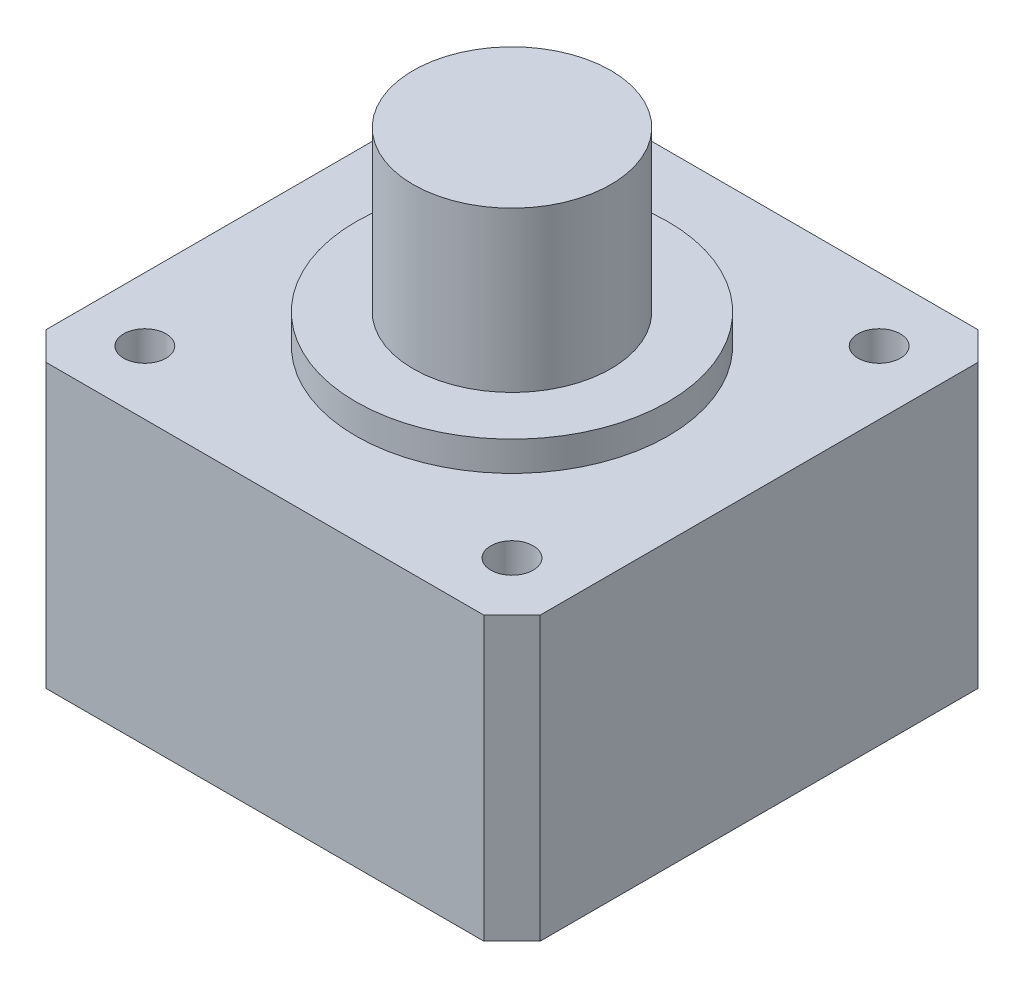
ISO-10303-21;
HEADER;
FILE_DESCRIPTION(('STEP AP214'),'2;1');
FILE_NAME('part.step','',(''),(''),'','','');
FILE_SCHEMA(('AUTOMOTIVE_DESIGN { 1 0 10303 214 1 1 1 1 }'));
ENDSEC;
DATA;
#1=APPLICATION_CONTEXT('core data for automotive mechanical design processes');
#2=APPLICATION_PROTOCOL_DEFINITION('international standard','automotive_design',2000,#1);
#3=PRODUCT_CONTEXT('',#1,'mechanical');
#4=PRODUCT('Part','Part','',(#3));
#5=PRODUCT_RELATED_PRODUCT_CATEGORY('part','',(#4));
#6=PRODUCT_DEFINITION_FORMATION('','',#4);
#7=PRODUCT_DEFINITION_CONTEXT('part definition',#1,'design');
#8=PRODUCT_DEFINITION('design','',#6,#7);
#9=PRODUCT_DEFINITION_SHAPE('','',#8);
#10=(LENGTH_UNIT() NAMED_UNIT(*) SI_UNIT(.MILLI.,.METRE.));
#11=(NAMED_UNIT(*) PLANE_ANGLE_UNIT() SI_UNIT($,.RADIAN.));
#12=(NAMED_UNIT(*) SI_UNIT($,.STERADIAN.) SOLID_ANGLE_UNIT());
#13=UNCERTAINTY_MEASURE_WITH_UNIT(LENGTH_MEASURE(1.E-05),#10,'distance_accuracy_value','');
#14=(GEOMETRIC_REPRESENTATION_CONTEXT(3) GLOBAL_UNCERTAINTY_ASSIGNED_CONTEXT((#13)) GLOBAL_UNIT_ASSIGNED_CONTEXT((#10,
#11,#12)) REPRESENTATION_CONTEXT('',''));
#15=CARTESIAN_POINT('',(0.,0.,0.));
#16=DIRECTION('',(0.,0.,1.));
#17=DIRECTION('',(1.,0.,0.));
#18=AXIS2_PLACEMENT_3D('',#15,#16,#17);
#19=CARTESIAN_POINT('',(0.,22.1,0.));
#20=DIRECTION('',(0.,1.,0.));
#21=DIRECTION('',(0.,0.,1.));
#22=AXIS2_PLACEMENT_3D('',#19,#20,#21);
#23=PLANE('',#22);
#24=CARTESIAN_POINT('',(0.,22.1,0.));
#25=DIRECTION('',(0.,1.,0.));
#26=DIRECTION('',(0.,0.,1.));
#27=AXIS2_PLACEMENT_3D('',#24,#25,#26);
#28=CIRCLE('',#27,11.05);
#29=CARTESIAN_POINT('',(0.,22.1,11.05));
#30=VERTEX_POINT('',#29);
#31=EDGE_CURVE('E192',#30,#30,#28,.T.);
#32=ORIENTED_EDGE('',*,*,#31,.T.);
#33=EDGE_LOOP('',(#32));
#34=FACE_BOUND('',#33,.T.);
#35=CARTESIAN_POINT('',(0.,22.1,0.));
#36=DIRECTION('',(0.,1.,0.));
#37=DIRECTION('',(0.,0.,1.));
#38=AXIS2_PLACEMENT_3D('',#35,#36,#37);
#39=CIRCLE('',#38,7.);
#40=CARTESIAN_POINT('',(0.,22.1,7.));
#41=VERTEX_POINT('',#40);
#42=EDGE_CURVE('E201',#41,#41,#39,.T.);
#43=ORIENTED_EDGE('',*,*,#42,.F.);
#44=EDGE_LOOP('',(#43));
#45=FACE_BOUND('',#44,.T.);
#46=ADVANCED_FACE('F33',(#34,#45),#23,.T.);
#47=CARTESIAN_POINT('',(0.,20.,0.));
#48=DIRECTION('',(0.,1.,0.));
#49=DIRECTION('',(0.,0.,1.));
#50=AXIS2_PLACEMENT_3D('',#47,#48,#49);
#51=PLANE('',#50);
#52=DIRECTION('',(0.,0.,1.));
#53=VECTOR('',#52,1.);
#54=CARTESIAN_POINT('',(-17.5,20.,-17.5));
#55=LINE('',#54,#53);
#56=CARTESIAN_POINT('',(-17.5,20.,-15.5));
#57=VERTEX_POINT('',#56);
#58=CARTESIAN_POINT('',(-17.5,20.,15.5));
#59=VERTEX_POINT('',#58);
#60=EDGE_CURVE('E170',#57,#59,#55,.T.);
#61=ORIENTED_EDGE('',*,*,#60,.T.);
#62=DIRECTION('',(-0.707106781186546,0.,-0.707106781186549));
#63=VECTOR('',#62,1.);
#64=CARTESIAN_POINT('',(-16.5,20.,16.5));
#65=LINE('',#64,#63);
#66=CARTESIAN_POINT('',(-15.5,20.,17.5));
#67=VERTEX_POINT('',#66);
#68=EDGE_CURVE('E147',#59,#67,#65,.F.);
#69=ORIENTED_EDGE('',*,*,#68,.T.);
#70=DIRECTION('',(1.,0.,0.));
#71=VECTOR('',#70,1.);
#72=CARTESIAN_POINT('',(-17.5,20.,17.5));
#73=LINE('',#72,#71);
#74=CARTESIAN_POINT('',(15.5,20.,17.5));
#75=VERTEX_POINT('',#74);
#76=EDGE_CURVE('E119',#67,#75,#73,.T.);
#77=ORIENTED_EDGE('',*,*,#76,.T.);
#78=DIRECTION('',(-0.707106781186551,0.,0.707106781186544));
#79=VECTOR('',#78,1.);
#80=CARTESIAN_POINT('',(16.4999999999999,20.,16.5000000000001));
#81=LINE('',#80,#79);
#82=CARTESIAN_POINT('',(17.5,20.,15.5));
#83=VERTEX_POINT('',#82);
#84=EDGE_CURVE('E142',#75,#83,#81,.F.);
#85=ORIENTED_EDGE('',*,*,#84,.T.);
#86=DIRECTION('',(0.,0.,-1.));
#87=VECTOR('',#86,1.);
#88=CARTESIAN_POINT('',(17.5,20.,-17.5));
#89=LINE('',#88,#87);
#90=CARTESIAN_POINT('',(17.5,20.,-15.5));
#91=VERTEX_POINT('',#90);
#92=EDGE_CURVE('E125',#83,#91,#89,.T.);
#93=ORIENTED_EDGE('',*,*,#92,.T.);
#94=DIRECTION('',(0.707106781186546,0.,0.707106781186549));
#95=VECTOR('',#94,1.);
#96=CARTESIAN_POINT('',(16.5,20.,-16.5));
#97=LINE('',#96,#95);
#98=CARTESIAN_POINT('',(15.5,20.,-17.5));
#99=VERTEX_POINT('',#98);
#100=EDGE_CURVE('E55',#91,#99,#97,.F.);
#101=ORIENTED_EDGE('',*,*,#100,.T.);
#102=DIRECTION('',(-1.,0.,0.));
#103=VECTOR('',#102,1.);
#104=CARTESIAN_POINT('',(-17.5,20.,-17.5));
#105=LINE('',#104,#103);
#106=CARTESIAN_POINT('',(-15.5,20.,-17.5));
#107=VERTEX_POINT('',#106);
#108=EDGE_CURVE('E128',#99,#107,#105,.T.);
#109=ORIENTED_EDGE('',*,*,#108,.T.);
#110=DIRECTION('',(0.70710678118655,0.,-0.707106781186545));
#111=VECTOR('',#110,1.);
#112=CARTESIAN_POINT('',(-16.5,20.,-16.5000000000001));
#113=LINE('',#112,#111);
#114=EDGE_CURVE('E145',#107,#57,#113,.F.);
#115=ORIENTED_EDGE('',*,*,#114,.T.);
#116=EDGE_LOOP('',(#61,#69,#77,#85,#93,#101,#109,#115));
#117=FACE_BOUND('',#116,.T.);
#118=CARTESIAN_POINT('',(-13.,20.,-13.));
#119=DIRECTION('',(0.,1.,0.));
#120=DIRECTION('',(0.,0.,1.));
#121=AXIS2_PLACEMENT_3D('',#118,#119,#120);
#122=CIRCLE('',#121,1.5);
#123=CARTESIAN_POINT('',(-13.,20.,-11.5));
#124=VERTEX_POINT('',#123);
#125=EDGE_CURVE('E166',#124,#124,#122,.T.);
#126=ORIENTED_EDGE('',*,*,#125,.F.);
#127=EDGE_LOOP('',(#126));
#128=FACE_BOUND('',#127,.T.);
#129=CARTESIAN_POINT('',(13.,20.,-13.));
#130=DIRECTION('',(0.,1.,0.));
#131=DIRECTION('',(0.,0.,1.));
#132=AXIS2_PLACEMENT_3D('',#129,#130,#131);
#133=CIRCLE('',#132,1.5);
#134=CARTESIAN_POINT('',(13.,20.,-11.5));
#135=VERTEX_POINT('',#134);
#136=EDGE_CURVE('E175',#135,#135,#133,.T.);
#137=ORIENTED_EDGE('',*,*,#136,.F.);
#138=EDGE_LOOP('',(#137));
#139=FACE_BOUND('',#138,.T.);
#140=CARTESIAN_POINT('',(13.,20.,13.));
#141=DIRECTION('',(0.,1.,0.));
#142=DIRECTION('',(0.,0.,1.));
#143=AXIS2_PLACEMENT_3D('',#140,#141,#142);
#144=CIRCLE('',#143,1.5);
#145=CARTESIAN_POINT('',(13.,20.,14.5));
#146=VERTEX_POINT('',#145);
#147=EDGE_CURVE('E180',#146,#146,#144,.T.);
#148=ORIENTED_EDGE('',*,*,#147,.F.);
#149=EDGE_LOOP('',(#148));
#150=FACE_BOUND('',#149,.T.);
#151=CARTESIAN_POINT('',(-13.,20.,13.));
#152=DIRECTION('',(0.,1.,0.));
#153=DIRECTION('',(0.,0.,1.));
#154=AXIS2_PLACEMENT_3D('',#151,#152,#153);
#155=CIRCLE('',#154,1.5);
#156=CARTESIAN_POINT('',(-13.,20.,14.5));
#157=VERTEX_POINT('',#156);
#158=EDGE_CURVE('E186',#157,#157,#155,.T.);
#159=ORIENTED_EDGE('',*,*,#158,.F.);
#160=EDGE_LOOP('',(#159));
#161=FACE_BOUND('',#160,.T.);
#162=CARTESIAN_POINT('',(0.,20.,0.));
#163=DIRECTION('',(0.,1.,0.));
#164=DIRECTION('',(0.,0.,1.));
#165=AXIS2_PLACEMENT_3D('',#162,#163,#164);
#166=CIRCLE('',#165,11.05);
#167=CARTESIAN_POINT('',(0.,20.,11.05));
#168=VERTEX_POINT('',#167);
#169=EDGE_CURVE('E195',#168,#168,#166,.T.);
#170=ORIENTED_EDGE('',*,*,#169,.F.);
#171=EDGE_LOOP('',(#170));
#172=FACE_BOUND('',#171,.T.);
#173=ADVANCED_FACE('F217',(#117,#128,#139,#150,#161,#172),#51,.T.);
#174=CARTESIAN_POINT('',(17.5,20.,-17.5));
#175=DIRECTION('',(-1.,0.,0.));
#176=DIRECTION('',(0.,0.,1.));
#177=AXIS2_PLACEMENT_3D('',#174,#175,#176);
#178=PLANE('',#177);
#179=DIRECTION('',(0.,0.,-1.));
#180=VECTOR('',#179,1.);
#181=CARTESIAN_POINT('',(17.5,0.,-17.5));
#182=LINE('',#181,#180);
#183=CARTESIAN_POINT('',(17.5,0.,15.5));
#184=VERTEX_POINT('',#183);
#185=CARTESIAN_POINT('',(17.5,0.,-15.5));
#186=VERTEX_POINT('',#185);
#187=EDGE_CURVE('E158',#184,#186,#182,.T.);
#188=ORIENTED_EDGE('',*,*,#187,.T.);
#189=DIRECTION('',(0.,1.,0.));
#190=VECTOR('',#189,1.);
#191=CARTESIAN_POINT('',(17.5,20.,-15.5));
#192=LINE('',#191,#190);
#193=EDGE_CURVE('E11',#186,#91,#192,.T.);
#194=ORIENTED_EDGE('',*,*,#193,.T.);
#195=ORIENTED_EDGE('',*,*,#92,.F.);
#196=DIRECTION('',(0.,-1.,0.));
#197=VECTOR('',#196,1.);
#198=CARTESIAN_POINT('',(17.5,20.,15.5));
#199=LINE('',#198,#197);
#200=EDGE_CURVE('E41',#83,#184,#199,.T.);
#201=ORIENTED_EDGE('',*,*,#200,.T.);
#202=EDGE_LOOP('',(#188,#194,#195,#201));
#203=FACE_BOUND('',#202,.T.);
#204=ADVANCED_FACE('F157',(#203),#178,.F.);
#205=CARTESIAN_POINT('',(-17.5,20.,-17.5));
#206=DIRECTION('',(0.,0.,1.));
#207=DIRECTION('',(1.,0.,0.));
#208=AXIS2_PLACEMENT_3D('',#205,#206,#207);
#209=PLANE('',#208);
#210=DIRECTION('',(-1.,0.,0.));
#211=VECTOR('',#210,1.);
#212=CARTESIAN_POINT('',(-17.5,0.,-17.5));
#213=LINE('',#212,#211);
#214=CARTESIAN_POINT('',(15.5,0.,-17.5));
#215=VERTEX_POINT('',#214);
#216=CARTESIAN_POINT('',(-15.5,0.,-17.5));
#217=VERTEX_POINT('',#216);
#218=EDGE_CURVE('E130',#215,#217,#213,.T.);
#219=ORIENTED_EDGE('',*,*,#218,.T.);
#220=DIRECTION('',(0.,1.,0.));
#221=VECTOR('',#220,1.);
#222=CARTESIAN_POINT('',(-15.5,20.,-17.5));
#223=LINE('',#222,#221);
#224=EDGE_CURVE('E48',#217,#107,#223,.T.);
#225=ORIENTED_EDGE('',*,*,#224,.T.);
#226=ORIENTED_EDGE('',*,*,#108,.F.);
#227=DIRECTION('',(0.,-1.,0.));
#228=VECTOR('',#227,1.);
#229=CARTESIAN_POINT('',(15.5,20.,-17.5));
#230=LINE('',#229,#228);
#231=EDGE_CURVE('E149',#99,#215,#230,.T.);
#232=ORIENTED_EDGE('',*,*,#231,.T.);
#233=EDGE_LOOP('',(#219,#225,#226,#232));
#234=FACE_BOUND('',#233,.T.);
#235=ADVANCED_FACE('F253',(#234),#209,.F.);
#236=CARTESIAN_POINT('',(-17.5,20.,-17.5));
#237=DIRECTION('',(1.,0.,0.));
#238=DIRECTION('',(0.,0.,-1.));
#239=AXIS2_PLACEMENT_3D('',#236,#237,#238);
#240=PLANE('',#239);
#241=DIRECTION('',(0.,0.,1.));
#242=VECTOR('',#241,1.);
#243=CARTESIAN_POINT('',(-17.5,0.,-17.5));
#244=LINE('',#243,#242);
#245=CARTESIAN_POINT('',(-17.5,0.,-15.5));
#246=VERTEX_POINT('',#245);
#247=CARTESIAN_POINT('',(-17.5,0.,15.5));
#248=VERTEX_POINT('',#247);
#249=EDGE_CURVE('E126',#246,#248,#244,.T.);
#250=ORIENTED_EDGE('',*,*,#249,.T.);
#251=DIRECTION('',(0.,1.,0.));
#252=VECTOR('',#251,1.);
#253=CARTESIAN_POINT('',(-17.5,20.,15.5));
#254=LINE('',#253,#252);
#255=EDGE_CURVE('E104',#248,#59,#254,.T.);
#256=ORIENTED_EDGE('',*,*,#255,.T.);
#257=ORIENTED_EDGE('',*,*,#60,.F.);
#258=DIRECTION('',(0.,-1.,0.));
#259=VECTOR('',#258,1.);
#260=CARTESIAN_POINT('',(-17.5,20.,-15.5));
#261=LINE('',#260,#259);
#262=EDGE_CURVE('E109',#57,#246,#261,.T.);
#263=ORIENTED_EDGE('',*,*,#262,.T.);
#264=EDGE_LOOP('',(#250,#256,#257,#263));
#265=FACE_BOUND('',#264,.T.);
#266=ADVANCED_FACE('F250',(#265),#240,.F.);
#267=CARTESIAN_POINT('',(-17.5,20.,17.5));
#268=DIRECTION('',(0.,0.,-1.));
#269=DIRECTION('',(-1.,0.,0.));
#270=AXIS2_PLACEMENT_3D('',#267,#268,#269);
#271=PLANE('',#270);
#272=ORIENTED_EDGE('',*,*,#76,.F.);
#273=DIRECTION('',(0.,-1.,0.));
#274=VECTOR('',#273,1.);
#275=CARTESIAN_POINT('',(-15.5,20.,17.5));
#276=LINE('',#275,#274);
#277=CARTESIAN_POINT('',(-15.5,0.,17.5));
#278=VERTEX_POINT('',#277);
#279=EDGE_CURVE('E103',#67,#278,#276,.T.);
#280=ORIENTED_EDGE('',*,*,#279,.T.);
#281=DIRECTION('',(1.,0.,0.));
#282=VECTOR('',#281,1.);
#283=CARTESIAN_POINT('',(-17.5,0.,17.5));
#284=LINE('',#283,#282);
#285=CARTESIAN_POINT('',(15.5,0.,17.5));
#286=VERTEX_POINT('',#285);
#287=EDGE_CURVE('E116',#278,#286,#284,.T.);
#288=ORIENTED_EDGE('',*,*,#287,.T.);
#289=DIRECTION('',(0.,1.,0.));
#290=VECTOR('',#289,1.);
#291=CARTESIAN_POINT('',(15.5,20.,17.5));
#292=LINE('',#291,#290);
#293=EDGE_CURVE('E121',#286,#75,#292,.T.);
#294=ORIENTED_EDGE('',*,*,#293,.T.);
#295=EDGE_LOOP('',(#272,#280,#288,#294));
#296=FACE_BOUND('',#295,.T.);
#297=ADVANCED_FACE('F115',(#296),#271,.F.);
#298=CARTESIAN_POINT('',(0.,0.,0.));
#299=DIRECTION('',(0.,1.,0.));
#300=DIRECTION('',(0.,0.,1.));
#301=AXIS2_PLACEMENT_3D('',#298,#299,#300);
#302=PLANE('',#301);
#303=CARTESIAN_POINT('',(-13.,0.,13.));
#304=DIRECTION('',(0.,1.,0.));
#305=DIRECTION('',(0.,0.,1.));
#306=AXIS2_PLACEMENT_3D('',#303,#304,#305);
#307=CIRCLE('',#306,1.5);
#308=CARTESIAN_POINT('',(-13.,0.,14.5));
#309=VERTEX_POINT('',#308);
#310=EDGE_CURVE('E189',#309,#309,#307,.T.);
#311=ORIENTED_EDGE('',*,*,#310,.T.);
#312=EDGE_LOOP('',(#311));
#313=FACE_BOUND('',#312,.T.);
#314=CARTESIAN_POINT('',(13.,0.,13.));
#315=DIRECTION('',(0.,1.,0.));
#316=DIRECTION('',(0.,0.,1.));
#317=AXIS2_PLACEMENT_3D('',#314,#315,#316);
#318=CIRCLE('',#317,1.5);
#319=CARTESIAN_POINT('',(13.,0.,14.5));
#320=VERTEX_POINT('',#319);
#321=EDGE_CURVE('E183',#320,#320,#318,.T.);
#322=ORIENTED_EDGE('',*,*,#321,.T.);
#323=EDGE_LOOP('',(#322));
#324=FACE_BOUND('',#323,.T.);
#325=CARTESIAN_POINT('',(13.,0.,-13.));
#326=DIRECTION('',(0.,1.,0.));
#327=DIRECTION('',(0.,0.,1.));
#328=AXIS2_PLACEMENT_3D('',#325,#326,#327);
#329=CIRCLE('',#328,1.5);
#330=CARTESIAN_POINT('',(13.,0.,-11.5));
#331=VERTEX_POINT('',#330);
#332=EDGE_CURVE('E177',#331,#331,#329,.T.);
#333=ORIENTED_EDGE('',*,*,#332,.T.);
#334=EDGE_LOOP('',(#333));
#335=FACE_BOUND('',#334,.T.);
#336=CARTESIAN_POINT('',(-13.,0.,-13.));
#337=DIRECTION('',(0.,1.,0.));
#338=DIRECTION('',(0.,0.,1.));
#339=AXIS2_PLACEMENT_3D('',#336,#337,#338);
#340=CIRCLE('',#339,1.5);
#341=CARTESIAN_POINT('',(-13.,0.,-11.5));
#342=VERTEX_POINT('',#341);
#343=EDGE_CURVE('E163',#342,#342,#340,.T.);
#344=ORIENTED_EDGE('',*,*,#343,.T.);
#345=EDGE_LOOP('',(#344));
#346=FACE_BOUND('',#345,.T.);
#347=ORIENTED_EDGE('',*,*,#287,.F.);
#348=DIRECTION('',(0.707106781186546,0.,0.707106781186549));
#349=VECTOR('',#348,1.);
#350=CARTESIAN_POINT('',(-15.5,0.,17.5));
#351=LINE('',#350,#349);
#352=EDGE_CURVE('E99',#278,#248,#351,.F.);
#353=ORIENTED_EDGE('',*,*,#352,.T.);
#354=ORIENTED_EDGE('',*,*,#249,.F.);
#355=DIRECTION('',(-0.70710678118655,0.,0.707106781186545));
#356=VECTOR('',#355,1.);
#357=CARTESIAN_POINT('',(-17.5,0.,-15.5));
#358=LINE('',#357,#356);
#359=EDGE_CURVE('E110',#246,#217,#358,.F.);
#360=ORIENTED_EDGE('',*,*,#359,.T.);
#361=ORIENTED_EDGE('',*,*,#218,.F.);
#362=DIRECTION('',(-0.707106781186546,0.,-0.707106781186549));
#363=VECTOR('',#362,1.);
#364=CARTESIAN_POINT('',(15.5,0.,-17.5));
#365=LINE('',#364,#363);
#366=EDGE_CURVE('E136',#215,#186,#365,.F.);
#367=ORIENTED_EDGE('',*,*,#366,.T.);
#368=ORIENTED_EDGE('',*,*,#187,.F.);
#369=DIRECTION('',(0.707106781186551,0.,-0.707106781186544));
#370=VECTOR('',#369,1.);
#371=CARTESIAN_POINT('',(17.5,0.,15.5));
#372=LINE('',#371,#370);
#373=EDGE_CURVE('E120',#184,#286,#372,.F.);
#374=ORIENTED_EDGE('',*,*,#373,.T.);
#375=EDGE_LOOP('',(#347,#353,#354,#360,#361,#367,#368,#374));
#376=FACE_BOUND('',#375,.T.);
#377=ADVANCED_FACE('F123',(#313,#324,#335,#346,#376),#302,.F.);
#378=CARTESIAN_POINT('',(-13.,0.,-13.));
#379=DIRECTION('',(0.,1.,0.));
#380=DIRECTION('',(0.,0.,1.));
#381=AXIS2_PLACEMENT_3D('',#378,#379,#380);
#382=CYLINDRICAL_SURFACE('',#381,1.5);
#383=ORIENTED_EDGE('',*,*,#343,.F.);
#384=EDGE_LOOP('',(#383));
#385=FACE_BOUND('',#384,.T.);
#386=ORIENTED_EDGE('',*,*,#125,.T.);
#387=EDGE_LOOP('',(#386));
#388=FACE_BOUND('',#387,.T.);
#389=ADVANCED_FACE('F240',(#385,#388),#382,.F.);
#390=CARTESIAN_POINT('',(13.,0.,-13.));
#391=DIRECTION('',(0.,1.,0.));
#392=DIRECTION('',(0.,0.,1.));
#393=AXIS2_PLACEMENT_3D('',#390,#391,#392);
#394=CYLINDRICAL_SURFACE('',#393,1.5);
#395=ORIENTED_EDGE('',*,*,#332,.F.);
#396=EDGE_LOOP('',(#395));
#397=FACE_BOUND('',#396,.T.);
#398=ORIENTED_EDGE('',*,*,#136,.T.);
#399=EDGE_LOOP('',(#398));
#400=FACE_BOUND('',#399,.T.);
#401=ADVANCED_FACE('F236',(#397,#400),#394,.F.);
#402=CARTESIAN_POINT('',(13.,0.,13.));
#403=DIRECTION('',(0.,1.,0.));
#404=DIRECTION('',(0.,0.,1.));
#405=AXIS2_PLACEMENT_3D('',#402,#403,#404);
#406=CYLINDRICAL_SURFACE('',#405,1.5);
#407=ORIENTED_EDGE('',*,*,#321,.F.);
#408=EDGE_LOOP('',(#407));
#409=FACE_BOUND('',#408,.T.);
#410=ORIENTED_EDGE('',*,*,#147,.T.);
#411=EDGE_LOOP('',(#410));
#412=FACE_BOUND('',#411,.T.);
#413=ADVANCED_FACE('F232',(#409,#412),#406,.F.);
#414=CARTESIAN_POINT('',(-13.,0.,13.));
#415=DIRECTION('',(0.,1.,0.));
#416=DIRECTION('',(0.,0.,1.));
#417=AXIS2_PLACEMENT_3D('',#414,#415,#416);
#418=CYLINDRICAL_SURFACE('',#417,1.5);
#419=ORIENTED_EDGE('',*,*,#310,.F.);
#420=EDGE_LOOP('',(#419));
#421=FACE_BOUND('',#420,.T.);
#422=ORIENTED_EDGE('',*,*,#158,.T.);
#423=EDGE_LOOP('',(#422));
#424=FACE_BOUND('',#423,.T.);
#425=ADVANCED_FACE('F229',(#421,#424),#418,.F.);
#426=CARTESIAN_POINT('',(-15.5,20.,17.5));
#427=DIRECTION('',(0.707106781186549,0.,-0.707106781186546));
#428=DIRECTION('',(0.,-1.,0.));
#429=AXIS2_PLACEMENT_3D('',#426,#427,#428);
#430=PLANE('',#429);
#431=ORIENTED_EDGE('',*,*,#68,.F.);
#432=ORIENTED_EDGE('',*,*,#255,.F.);
#433=ORIENTED_EDGE('',*,*,#352,.F.);
#434=ORIENTED_EDGE('',*,*,#279,.F.);
#435=EDGE_LOOP('',(#431,#432,#433,#434));
#436=FACE_BOUND('',#435,.T.);
#437=ADVANCED_FACE('F102',(#436),#430,.F.);
#438=CARTESIAN_POINT('',(-17.5,20.,-15.5));
#439=DIRECTION('',(0.707106781186545,0.,0.70710678118655));
#440=DIRECTION('',(0.,-1.,0.));
#441=AXIS2_PLACEMENT_3D('',#438,#439,#440);
#442=PLANE('',#441);
#443=ORIENTED_EDGE('',*,*,#114,.F.);
#444=ORIENTED_EDGE('',*,*,#224,.F.);
#445=ORIENTED_EDGE('',*,*,#359,.F.);
#446=ORIENTED_EDGE('',*,*,#262,.F.);
#447=EDGE_LOOP('',(#443,#444,#445,#446));
#448=FACE_BOUND('',#447,.T.);
#449=ADVANCED_FACE('F261',(#448),#442,.F.);
#450=CARTESIAN_POINT('',(15.5,20.,-17.5));
#451=DIRECTION('',(-0.707106781186549,0.,0.707106781186546));
#452=DIRECTION('',(0.,-1.,0.));
#453=AXIS2_PLACEMENT_3D('',#450,#451,#452);
#454=PLANE('',#453);
#455=ORIENTED_EDGE('',*,*,#100,.F.);
#456=ORIENTED_EDGE('',*,*,#193,.F.);
#457=ORIENTED_EDGE('',*,*,#366,.F.);
#458=ORIENTED_EDGE('',*,*,#231,.F.);
#459=EDGE_LOOP('',(#455,#456,#457,#458));
#460=FACE_BOUND('',#459,.T.);
#461=ADVANCED_FACE('F263',(#460),#454,.F.);
#462=CARTESIAN_POINT('',(17.5,20.,15.5));
#463=DIRECTION('',(-0.707106781186544,0.,-0.707106781186551));
#464=DIRECTION('',(0.,-1.,0.));
#465=AXIS2_PLACEMENT_3D('',#462,#463,#464);
#466=PLANE('',#465);
#467=ORIENTED_EDGE('',*,*,#84,.F.);
#468=ORIENTED_EDGE('',*,*,#293,.F.);
#469=ORIENTED_EDGE('',*,*,#373,.F.);
#470=ORIENTED_EDGE('',*,*,#200,.F.);
#471=EDGE_LOOP('',(#467,#468,#469,#470));
#472=FACE_BOUND('',#471,.T.);
#473=ADVANCED_FACE('F35',(#472),#466,.F.);
#474=CARTESIAN_POINT('',(0.,22.1,0.));
#475=DIRECTION('',(0.,-1.,0.));
#476=DIRECTION('',(0.,0.,-1.));
#477=AXIS2_PLACEMENT_3D('',#474,#475,#476);
#478=CYLINDRICAL_SURFACE('',#477,11.05);
#479=ORIENTED_EDGE('',*,*,#31,.F.);
#480=EDGE_LOOP('',(#479));
#481=FACE_BOUND('',#480,.T.);
#482=ORIENTED_EDGE('',*,*,#169,.T.);
#483=EDGE_LOOP('',(#482));
#484=FACE_BOUND('',#483,.T.);
#485=ADVANCED_FACE('F212',(#481,#484),#478,.T.);
#486=CARTESIAN_POINT('',(0.,33.4,0.));
#487=DIRECTION('',(0.,-1.,0.));
#488=DIRECTION('',(0.,0.,-1.));
#489=AXIS2_PLACEMENT_3D('',#486,#487,#488);
#490=CYLINDRICAL_SURFACE('',#489,7.);
#491=CARTESIAN_POINT('',(0.,33.4,0.));
#492=DIRECTION('',(0.,1.,0.));
#493=DIRECTION('',(0.,0.,1.));
#494=AXIS2_PLACEMENT_3D('',#491,#492,#493);
#495=CIRCLE('',#494,7.);
#496=CARTESIAN_POINT('',(0.,33.4,7.));
#497=VERTEX_POINT('',#496);
#498=EDGE_CURVE('E198',#497,#497,#495,.T.);
#499=ORIENTED_EDGE('',*,*,#498,.F.);
#500=EDGE_LOOP('',(#499));
#501=FACE_BOUND('',#500,.T.);
#502=ORIENTED_EDGE('',*,*,#42,.T.);
#503=EDGE_LOOP('',(#502));
#504=FACE_BOUND('',#503,.T.);
#505=ADVANCED_FACE('F209',(#501,#504),#490,.T.);
#506=CARTESIAN_POINT('',(0.,33.4,0.));
#507=DIRECTION('',(0.,1.,0.));
#508=DIRECTION('',(0.,0.,1.));
#509=AXIS2_PLACEMENT_3D('',#506,#507,#508);
#510=PLANE('',#509);
#511=ORIENTED_EDGE('',*,*,#498,.T.);
#512=EDGE_LOOP('',(#511));
#513=FACE_BOUND('',#512,.T.);
#514=ADVANCED_FACE('F207',(#513),#510,.T.);
#515=CLOSED_SHELL('',(#46,#173,#204,#235,#266,#297,#377,#389,#401,#413,#425,#437,#449,#461,#473,
#485,#505,#514));
#516=MANIFOLD_SOLID_BREP('B2',#515);
#517=ADVANCED_BREP_SHAPE_REPRESENTATION('',(#18,#516),#14);
#518=SHAPE_DEFINITION_REPRESENTATION(#9,#517);
ENDSEC;
END-ISO-10303-21;
